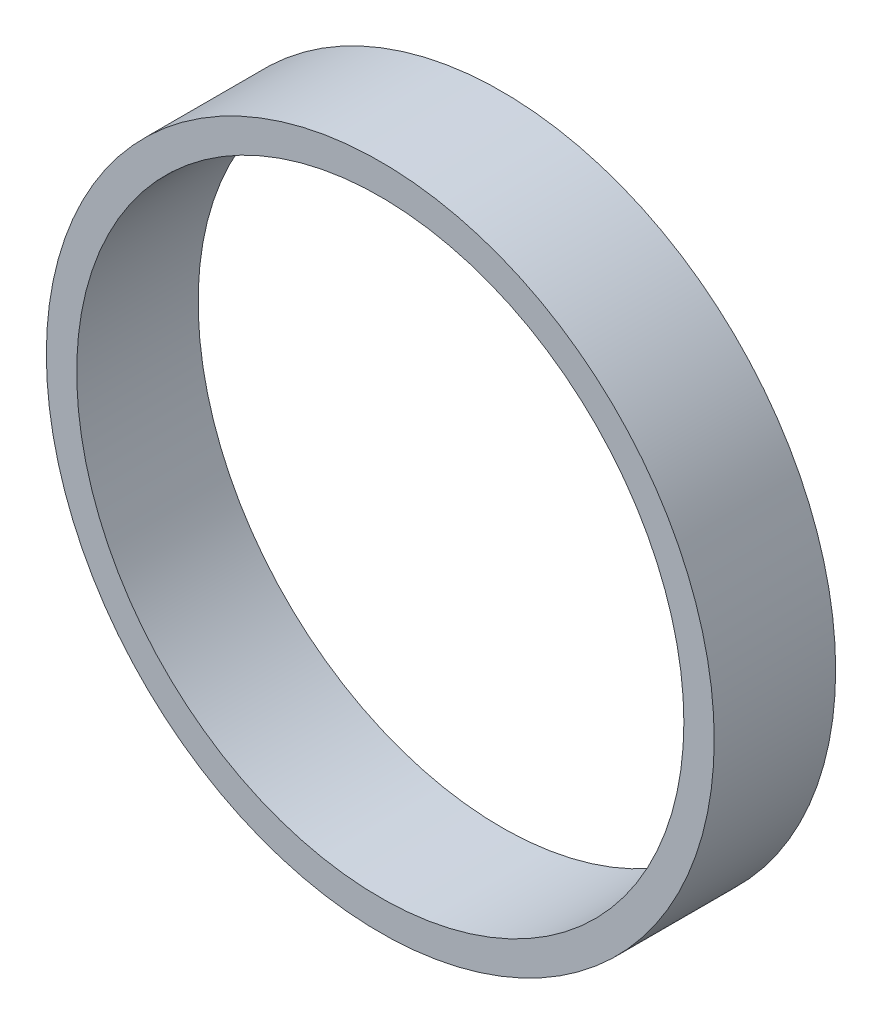
ISO-10303-21;
HEADER;
FILE_DESCRIPTION(('STEP AP214'),'2;1');
FILE_NAME('part.step','',(''),(''),'','','');
FILE_SCHEMA(('AUTOMOTIVE_DESIGN { 1 0 10303 214 1 1 1 1 }'));
ENDSEC;
DATA;
#1=APPLICATION_CONTEXT('core data for automotive mechanical design processes');
#2=APPLICATION_PROTOCOL_DEFINITION('international standard','automotive_design',2000,#1);
#3=PRODUCT_CONTEXT('',#1,'mechanical');
#4=PRODUCT('Part','Part','',(#3));
#5=PRODUCT_RELATED_PRODUCT_CATEGORY('part','',(#4));
#6=PRODUCT_DEFINITION_FORMATION('','',#4);
#7=PRODUCT_DEFINITION_CONTEXT('part definition',#1,'design');
#8=PRODUCT_DEFINITION('design','',#6,#7);
#9=PRODUCT_DEFINITION_SHAPE('','',#8);
#10=(LENGTH_UNIT() NAMED_UNIT(*) SI_UNIT(.MILLI.,.METRE.));
#11=(NAMED_UNIT(*) PLANE_ANGLE_UNIT() SI_UNIT($,.RADIAN.));
#12=(NAMED_UNIT(*) SI_UNIT($,.STERADIAN.) SOLID_ANGLE_UNIT());
#13=UNCERTAINTY_MEASURE_WITH_UNIT(LENGTH_MEASURE(1.E-05),#10,'distance_accuracy_value','');
#14=(GEOMETRIC_REPRESENTATION_CONTEXT(3) GLOBAL_UNCERTAINTY_ASSIGNED_CONTEXT((#13)) GLOBAL_UNIT_ASSIGNED_CONTEXT((#10,
#11,#12)) REPRESENTATION_CONTEXT('',''));
#15=CARTESIAN_POINT('',(0.,0.,0.));
#16=DIRECTION('',(0.,0.,1.));
#17=DIRECTION('',(1.,0.,0.));
#18=AXIS2_PLACEMENT_3D('',#15,#16,#17);
#19=CARTESIAN_POINT('',(0.,0.,2.));
#20=DIRECTION('',(0.,0.,1.));
#21=DIRECTION('',(1.,0.,0.));
#22=AXIS2_PLACEMENT_3D('',#19,#20,#21);
#23=PLANE('',#22);
#24=CARTESIAN_POINT('',(0.,0.,2.));
#25=DIRECTION('',(0.,0.,1.));
#26=DIRECTION('',(1.,0.,0.));
#27=AXIS2_PLACEMENT_3D('',#24,#25,#26);
#28=CIRCLE('',#27,5.5);
#29=CARTESIAN_POINT('',(5.5,0.,2.));
#30=VERTEX_POINT('',#29);
#31=EDGE_CURVE('E10',#30,#30,#28,.T.);
#32=ORIENTED_EDGE('',*,*,#31,.T.);
#33=EDGE_LOOP('',(#32));
#34=FACE_BOUND('',#33,.T.);
#35=CARTESIAN_POINT('',(0.,0.,2.));
#36=DIRECTION('',(0.,0.,1.));
#37=DIRECTION('',(1.,0.,0.));
#38=AXIS2_PLACEMENT_3D('',#35,#36,#37);
#39=CIRCLE('',#38,5.);
#40=CARTESIAN_POINT('',(5.,0.,2.));
#41=VERTEX_POINT('',#40);
#42=EDGE_CURVE('E56',#41,#41,#39,.T.);
#43=ORIENTED_EDGE('',*,*,#42,.F.);
#44=EDGE_LOOP('',(#43));
#45=FACE_BOUND('',#44,.T.);
#46=ADVANCED_FACE('F43',(#34,#45),#23,.T.);
#47=CARTESIAN_POINT('',(0.,0.,0.));
#48=DIRECTION('',(0.,0.,1.));
#49=DIRECTION('',(1.,0.,0.));
#50=AXIS2_PLACEMENT_3D('',#47,#48,#49);
#51=PLANE('',#50);
#52=CARTESIAN_POINT('',(0.,0.,0.));
#53=DIRECTION('',(0.,0.,1.));
#54=DIRECTION('',(1.,0.,0.));
#55=AXIS2_PLACEMENT_3D('',#52,#53,#54);
#56=CIRCLE('',#55,5.5);
#57=CARTESIAN_POINT('',(5.5,0.,0.));
#58=VERTEX_POINT('',#57);
#59=EDGE_CURVE('E47',#58,#58,#56,.T.);
#60=ORIENTED_EDGE('',*,*,#59,.F.);
#61=EDGE_LOOP('',(#60));
#62=FACE_BOUND('',#61,.T.);
#63=CARTESIAN_POINT('',(0.,0.,0.));
#64=DIRECTION('',(0.,0.,1.));
#65=DIRECTION('',(1.,0.,0.));
#66=AXIS2_PLACEMENT_3D('',#63,#64,#65);
#67=CIRCLE('',#66,5.);
#68=CARTESIAN_POINT('',(5.,0.,0.));
#69=VERTEX_POINT('',#68);
#70=EDGE_CURVE('E58',#69,#69,#67,.T.);
#71=ORIENTED_EDGE('',*,*,#70,.T.);
#72=EDGE_LOOP('',(#71));
#73=FACE_BOUND('',#72,.T.);
#74=ADVANCED_FACE('F70',(#62,#73),#51,.F.);
#75=CARTESIAN_POINT('',(0.,0.,2.));
#76=DIRECTION('',(0.,0.,-1.));
#77=DIRECTION('',(-1.,0.,0.));
#78=AXIS2_PLACEMENT_3D('',#75,#76,#77);
#79=CYLINDRICAL_SURFACE('',#78,5.5);
#80=ORIENTED_EDGE('',*,*,#31,.F.);
#81=EDGE_LOOP('',(#80));
#82=FACE_BOUND('',#81,.T.);
#83=ORIENTED_EDGE('',*,*,#59,.T.);
#84=EDGE_LOOP('',(#83));
#85=FACE_BOUND('',#84,.T.);
#86=ADVANCED_FACE('F45',(#82,#85),#79,.T.);
#87=CARTESIAN_POINT('',(0.,0.,2.));
#88=DIRECTION('',(0.,0.,-1.));
#89=DIRECTION('',(-1.,0.,0.));
#90=AXIS2_PLACEMENT_3D('',#87,#88,#89);
#91=CYLINDRICAL_SURFACE('',#90,5.);
#92=ORIENTED_EDGE('',*,*,#42,.T.);
#93=EDGE_LOOP('',(#92));
#94=FACE_BOUND('',#93,.T.);
#95=ORIENTED_EDGE('',*,*,#70,.F.);
#96=EDGE_LOOP('',(#95));
#97=FACE_BOUND('',#96,.T.);
#98=ADVANCED_FACE('F66',(#94,#97),#91,.F.);
#99=CLOSED_SHELL('',(#46,#74,#86,#98));
#100=MANIFOLD_SOLID_BREP('B2',#99);
#101=ADVANCED_BREP_SHAPE_REPRESENTATION('',(#18,#100),#14);
#102=SHAPE_DEFINITION_REPRESENTATION(#9,#101);
ENDSEC;
END-ISO-10303-21;
